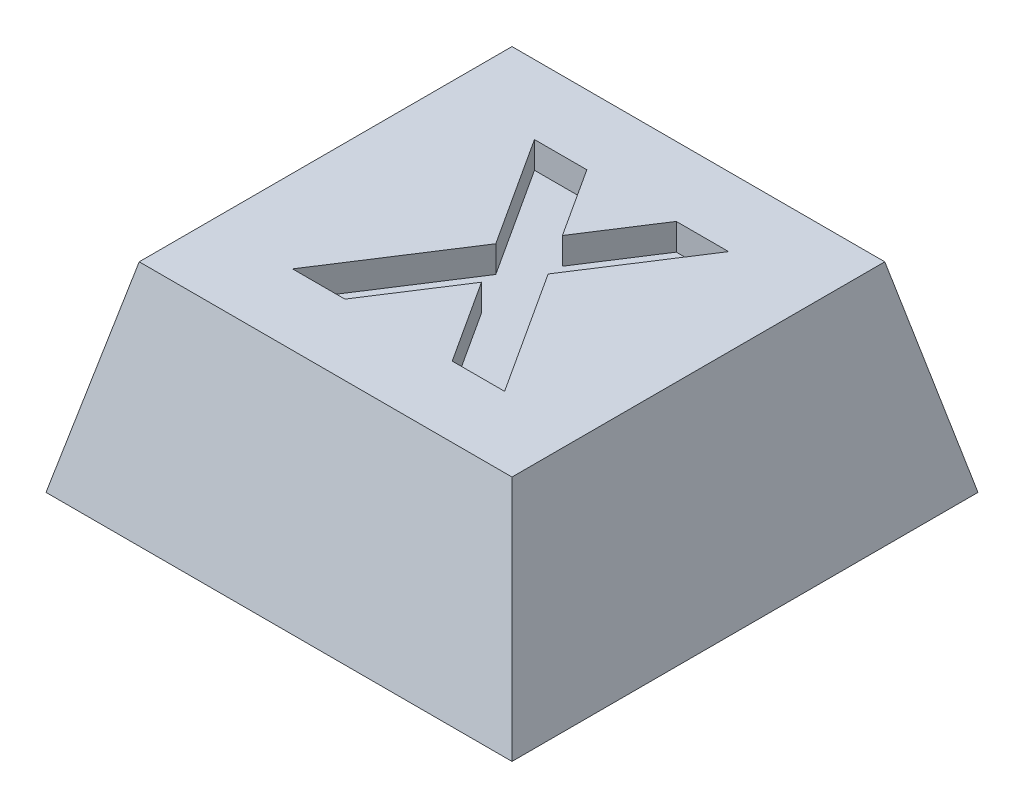
ISO-10303-21;
HEADER;
FILE_DESCRIPTION(('STEP AP214'),'2;1');
FILE_NAME('part.step','',(''),(''),'','','');
FILE_SCHEMA(('AUTOMOTIVE_DESIGN { 1 0 10303 214 1 1 1 1 }'));
ENDSEC;
DATA;
#1=APPLICATION_CONTEXT('core data for automotive mechanical design processes');
#2=APPLICATION_PROTOCOL_DEFINITION('international standard','automotive_design',2000,#1);
#3=PRODUCT_CONTEXT('',#1,'mechanical');
#4=PRODUCT('Part','Part','',(#3));
#5=PRODUCT_RELATED_PRODUCT_CATEGORY('part','',(#4));
#6=PRODUCT_DEFINITION_FORMATION('','',#4);
#7=PRODUCT_DEFINITION_CONTEXT('part definition',#1,'design');
#8=PRODUCT_DEFINITION('design','',#6,#7);
#9=PRODUCT_DEFINITION_SHAPE('','',#8);
#10=(LENGTH_UNIT() NAMED_UNIT(*) SI_UNIT(.MILLI.,.METRE.));
#11=(NAMED_UNIT(*) PLANE_ANGLE_UNIT() SI_UNIT($,.RADIAN.));
#12=(NAMED_UNIT(*) SI_UNIT($,.STERADIAN.) SOLID_ANGLE_UNIT());
#13=UNCERTAINTY_MEASURE_WITH_UNIT(LENGTH_MEASURE(1.E-05),#10,'distance_accuracy_value','');
#14=(GEOMETRIC_REPRESENTATION_CONTEXT(3) GLOBAL_UNCERTAINTY_ASSIGNED_CONTEXT((#13)) GLOBAL_UNIT_ASSIGNED_CONTEXT((#10,
#11,#12)) REPRESENTATION_CONTEXT('',''));
#15=CARTESIAN_POINT('',(0.,0.,0.));
#16=DIRECTION('',(0.,0.,1.));
#17=DIRECTION('',(1.,0.,0.));
#18=AXIS2_PLACEMENT_3D('',#15,#16,#17);
#19=CARTESIAN_POINT('',(0.,3.,0.));
#20=DIRECTION('',(0.,-1.,0.));
#21=DIRECTION('',(0.,0.,-1.));
#22=AXIS2_PLACEMENT_3D('',#19,#20,#21);
#23=PLANE('',#22);
#24=DIRECTION('',(-1.,0.,0.));
#25=VECTOR('',#24,1.);
#26=CARTESIAN_POINT('',(11.,3.,-0.7));
#27=LINE('',#26,#25);
#28=CARTESIAN_POINT('',(6.3,3.,-0.7));
#29=VERTEX_POINT('',#28);
#30=CARTESIAN_POINT('',(0.7,3.,-0.7));
#31=VERTEX_POINT('',#30);
#32=EDGE_CURVE('E65',#29,#31,#27,.T.);
#33=ORIENTED_EDGE('',*,*,#32,.F.);
#34=DIRECTION('',(0.,0.,1.));
#35=VECTOR('',#34,1.);
#36=CARTESIAN_POINT('',(6.3,3.,-7.));
#37=LINE('',#36,#35);
#38=CARTESIAN_POINT('',(6.3,3.,-6.3));
#39=VERTEX_POINT('',#38);
#40=EDGE_CURVE('E206',#39,#29,#37,.T.);
#41=ORIENTED_EDGE('',*,*,#40,.F.);
#42=DIRECTION('',(-1.,0.,0.));
#43=VECTOR('',#42,1.);
#44=CARTESIAN_POINT('',(11.,3.,-6.3));
#45=LINE('',#44,#43);
#46=CARTESIAN_POINT('',(0.699999999999998,3.,-6.3));
#47=VERTEX_POINT('',#46);
#48=EDGE_CURVE('E193',#39,#47,#45,.T.);
#49=ORIENTED_EDGE('',*,*,#48,.T.);
#50=DIRECTION('',(0.,0.,1.));
#51=VECTOR('',#50,1.);
#52=CARTESIAN_POINT('',(0.7,3.,-7.));
#53=LINE('',#52,#51);
#54=EDGE_CURVE('E207',#47,#31,#53,.T.);
#55=ORIENTED_EDGE('',*,*,#54,.T.);
#56=EDGE_LOOP('',(#33,#41,#49,#55));
#57=FACE_BOUND('',#56,.T.);
#58=DIRECTION('',(-1.,0.,0.));
#59=VECTOR('',#58,1.);
#60=CARTESIAN_POINT('',(2.73030412595201,3.,-1.75928235155919));
#61=LINE('',#60,#59);
#62=CARTESIAN_POINT('',(2.73030412595201,3.,-1.75928235155919));
#63=VERTEX_POINT('',#62);
#64=CARTESIAN_POINT('',(1.94364547210585,3.,-1.75928235155919));
#65=VERTEX_POINT('',#64);
#66=EDGE_CURVE('E58',#63,#65,#61,.T.);
#67=ORIENTED_EDGE('',*,*,#66,.T.);
#68=DIRECTION('',(0.543290774968153,0.,-0.839544599074107));
#69=VECTOR('',#68,1.);
#70=CARTESIAN_POINT('',(1.94364547210585,3.,-1.75928235155919));
#71=LINE('',#70,#69);
#72=CARTESIAN_POINT('',(3.1432648631315,3.,-3.61304837720022));
#73=VERTEX_POINT('',#72);
#74=EDGE_CURVE('E177',#65,#73,#71,.T.);
#75=ORIENTED_EDGE('',*,*,#74,.T.);
#76=DIRECTION('',(-0.543177141809505,0.,-0.839618123086714));
#77=VECTOR('',#76,1.);
#78=CARTESIAN_POINT('',(3.1432648631315,3.,-3.61304837720022));
#79=LINE('',#78,#77);
#80=CARTESIAN_POINT('',(2.07826085672124,3.,-5.25928235155919));
#81=VERTEX_POINT('',#80);
#82=EDGE_CURVE('E532',#73,#81,#79,.T.);
#83=ORIENTED_EDGE('',*,*,#82,.T.);
#84=DIRECTION('',(1.,0.,0.));
#85=VECTOR('',#84,1.);
#86=CARTESIAN_POINT('',(2.07826085672124,3.,-5.25928235155919));
#87=LINE('',#86,#85);
#88=CARTESIAN_POINT('',(2.86491951056739,3.,-5.25928235155919));
#89=VERTEX_POINT('',#88);
#90=EDGE_CURVE('E534',#81,#89,#87,.T.);
#91=ORIENTED_EDGE('',*,*,#90,.T.);
#92=DIRECTION('',(0.543133735363525,0.,0.839646202581816));
#93=VECTOR('',#92,1.);
#94=CARTESIAN_POINT('',(2.86491951056739,3.,-5.25928235155919));
#95=LINE('',#94,#93);
#96=CARTESIAN_POINT('',(3.53659419005457,3.,-4.22092097335407));
#97=VERTEX_POINT('',#96);
#98=EDGE_CURVE('E539',#89,#97,#95,.T.);
#99=ORIENTED_EDGE('',*,*,#98,.T.);
#100=DIRECTION('',(0.543133735363524,0.,-0.839646202581817));
#101=VECTOR('',#100,1.);
#102=CARTESIAN_POINT('',(3.53659419005457,3.,-4.22092097335407));
#103=LINE('',#102,#101);
#104=CARTESIAN_POINT('',(4.20826886954175,3.,-5.25928235155919));
#105=VERTEX_POINT('',#104);
#106=EDGE_CURVE('E549',#97,#105,#103,.T.);
#107=ORIENTED_EDGE('',*,*,#106,.T.);
#108=DIRECTION('',(1.,0.,0.));
#109=VECTOR('',#108,1.);
#110=CARTESIAN_POINT('',(4.20826886954175,3.,-5.25928235155919));
#111=LINE('',#110,#109);
#112=CARTESIAN_POINT('',(4.99492752338791,3.,-5.25928235155919));
#113=VERTEX_POINT('',#112);
#114=EDGE_CURVE('E553',#105,#113,#111,.T.);
#115=ORIENTED_EDGE('',*,*,#114,.T.);
#116=DIRECTION('',(-0.543177141809505,0.,0.839618123086714));
#117=VECTOR('',#116,1.);
#118=CARTESIAN_POINT('',(4.99492752338791,3.,-5.25928235155919));
#119=LINE('',#118,#117);
#120=CARTESIAN_POINT('',(3.92992351697765,3.,-3.61304837720022));
#121=VERTEX_POINT('',#120);
#122=EDGE_CURVE('E557',#113,#121,#119,.T.);
#123=ORIENTED_EDGE('',*,*,#122,.T.);
#124=DIRECTION('',(0.543290774968153,0.,0.839544599074107));
#125=VECTOR('',#124,1.);
#126=CARTESIAN_POINT('',(3.92992351697765,3.,-3.61304837720022));
#127=LINE('',#126,#125);
#128=CARTESIAN_POINT('',(5.12954290800329,3.,-1.75928235155919));
#129=VERTEX_POINT('',#128);
#130=EDGE_CURVE('E498',#121,#129,#127,.T.);
#131=ORIENTED_EDGE('',*,*,#130,.T.);
#132=DIRECTION('',(-1.,0.,0.));
#133=VECTOR('',#132,1.);
#134=CARTESIAN_POINT('',(5.12954290800329,3.,-1.75928235155919));
#135=LINE('',#134,#133);
#136=CARTESIAN_POINT('',(4.34288425415714,3.,-1.75928235155919));
#137=VERTEX_POINT('',#136);
#138=EDGE_CURVE('E493',#129,#137,#135,.T.);
#139=ORIENTED_EDGE('',*,*,#138,.T.);
#140=DIRECTION('',(-0.543310044190695,0.,-0.839532129153796));
#141=VECTOR('',#140,1.);
#142=CARTESIAN_POINT('',(4.34288425415714,3.,-1.75928235155919));
#143=LINE('',#142,#141);
#144=CARTESIAN_POINT('',(3.53659419005457,3.,-3.00517578104637));
#145=VERTEX_POINT('',#144);
#146=EDGE_CURVE('E487',#137,#145,#143,.T.);
#147=ORIENTED_EDGE('',*,*,#146,.T.);
#148=DIRECTION('',(-0.543310044190695,0.,0.839532129153796));
#149=VECTOR('',#148,1.);
#150=CARTESIAN_POINT('',(3.53659419005457,3.,-3.00517578104637));
#151=LINE('',#150,#149);
#152=EDGE_CURVE('E173',#145,#63,#151,.T.);
#153=ORIENTED_EDGE('',*,*,#152,.T.);
#154=EDGE_LOOP('',(#67,#75,#83,#91,#99,#107,#115,#123,#131,#139,#147,#153));
#155=FACE_BOUND('',#154,.T.);
#156=ADVANCED_FACE('F42',(#57,#155),#23,.F.);
#157=CARTESIAN_POINT('',(7.,0.,-7.));
#158=DIRECTION('',(-0.973841209741793,-0.227229615606418,0.));
#159=DIRECTION('',(0.227229615606418,-0.973841209741793,0.));
#160=AXIS2_PLACEMENT_3D('',#157,#158,#159);
#161=PLANE('',#160);
#162=DIRECTION('',(-0.221581128241521,0.949633406749377,-0.221581128241521));
#163=VECTOR('',#162,1.);
#164=CARTESIAN_POINT('',(6.6563126252505,1.47294589178357,-0.343687374749499));
#165=LINE('',#164,#163);
#166=CARTESIAN_POINT('',(7.,0.,0.));
#167=VERTEX_POINT('',#166);
#168=EDGE_CURVE('E203',#167,#29,#165,.T.);
#169=ORIENTED_EDGE('',*,*,#168,.F.);
#170=DIRECTION('',(0.,0.,-1.));
#171=VECTOR('',#170,1.);
#172=CARTESIAN_POINT('',(7.,0.,0.));
#173=LINE('',#172,#171);
#174=CARTESIAN_POINT('',(7.,0.,-7.));
#175=VERTEX_POINT('',#174);
#176=EDGE_CURVE('E221',#167,#175,#173,.T.);
#177=ORIENTED_EDGE('',*,*,#176,.T.);
#178=DIRECTION('',(0.221581128241521,-0.949633406749377,-0.221581128241521));
#179=VECTOR('',#178,1.);
#180=CARTESIAN_POINT('',(7.,0.,-7.));
#181=LINE('',#180,#179);
#182=EDGE_CURVE('E197',#39,#175,#181,.T.);
#183=ORIENTED_EDGE('',*,*,#182,.F.);
#184=ORIENTED_EDGE('',*,*,#40,.T.);
#185=EDGE_LOOP('',(#169,#177,#183,#184));
#186=FACE_BOUND('',#185,.T.);
#187=ADVANCED_FACE('F246',(#186),#161,.F.);
#188=CARTESIAN_POINT('',(0.,0.,-7.));
#189=DIRECTION('',(0.973841209741793,-0.227229615606418,0.));
#190=DIRECTION('',(0.227229615606418,0.973841209741793,0.));
#191=AXIS2_PLACEMENT_3D('',#188,#189,#190);
#192=PLANE('',#191);
#193=DIRECTION('',(-0.221581128241521,-0.949633406749378,0.221581128241521));
#194=VECTOR('',#193,1.);
#195=CARTESIAN_POINT('',(0.343687374749499,1.47294589178357,-0.3436873747495));
#196=LINE('',#195,#194);
#197=CARTESIAN_POINT('',(0.,0.,0.));
#198=VERTEX_POINT('',#197);
#199=EDGE_CURVE('E11',#31,#198,#196,.T.);
#200=ORIENTED_EDGE('',*,*,#199,.F.);
#201=ORIENTED_EDGE('',*,*,#54,.F.);
#202=DIRECTION('',(0.221581128241521,0.949633406749377,0.221581128241521));
#203=VECTOR('',#202,1.);
#204=CARTESIAN_POINT('',(0.,0.,-7.));
#205=LINE('',#204,#203);
#206=CARTESIAN_POINT('',(0.,0.,-7.));
#207=VERTEX_POINT('',#206);
#208=EDGE_CURVE('E51',#207,#47,#205,.T.);
#209=ORIENTED_EDGE('',*,*,#208,.F.);
#210=DIRECTION('',(0.,0.,1.));
#211=VECTOR('',#210,1.);
#212=CARTESIAN_POINT('',(0.,0.,0.));
#213=LINE('',#212,#211);
#214=EDGE_CURVE('E211',#207,#198,#213,.T.);
#215=ORIENTED_EDGE('',*,*,#214,.T.);
#216=EDGE_LOOP('',(#200,#201,#209,#215));
#217=FACE_BOUND('',#216,.T.);
#218=ADVANCED_FACE('F239',(#217),#192,.F.);
#219=CARTESIAN_POINT('',(0.,0.,0.));
#220=DIRECTION('',(0.,-1.,0.));
#221=DIRECTION('',(0.,0.,-1.));
#222=AXIS2_PLACEMENT_3D('',#219,#220,#221);
#223=PLANE('',#222);
#224=CARTESIAN_POINT('',(3.5,0.,-3.5));
#225=DIRECTION('',(0.,-1.,0.));
#226=DIRECTION('',(0.,0.,-1.));
#227=AXIS2_PLACEMENT_3D('',#224,#225,#226);
#228=CIRCLE('',#227,1.8);
#229=CARTESIAN_POINT('',(3.5,0.,-5.3));
#230=VERTEX_POINT('',#229);
#231=EDGE_CURVE('E179',#230,#230,#228,.T.);
#232=ORIENTED_EDGE('',*,*,#231,.F.);
#233=EDGE_LOOP('',(#232));
#234=FACE_BOUND('',#233,.T.);
#235=ORIENTED_EDGE('',*,*,#214,.F.);
#236=DIRECTION('',(-1.,0.,0.));
#237=VECTOR('',#236,1.);
#238=CARTESIAN_POINT('',(0.,0.,-7.));
#239=LINE('',#238,#237);
#240=EDGE_CURVE('E225',#175,#207,#239,.T.);
#241=ORIENTED_EDGE('',*,*,#240,.F.);
#242=ORIENTED_EDGE('',*,*,#176,.F.);
#243=DIRECTION('',(1.,0.,0.));
#244=VECTOR('',#243,1.);
#245=CARTESIAN_POINT('',(0.,0.,0.));
#246=LINE('',#245,#244);
#247=EDGE_CURVE('E218',#198,#167,#246,.T.);
#248=ORIENTED_EDGE('',*,*,#247,.F.);
#249=EDGE_LOOP('',(#235,#241,#242,#248));
#250=FACE_BOUND('',#249,.T.);
#251=ADVANCED_FACE('F44',(#234,#250),#223,.T.);
#252=CARTESIAN_POINT('',(11.,3.,-6.3));
#253=DIRECTION('',(0.,0.227229615606418,-0.973841209741793));
#254=DIRECTION('',(0.,0.973841209741793,0.227229615606418));
#255=AXIS2_PLACEMENT_3D('',#252,#253,#254);
#256=PLANE('',#255);
#257=ORIENTED_EDGE('',*,*,#182,.T.);
#258=ORIENTED_EDGE('',*,*,#240,.T.);
#259=ORIENTED_EDGE('',*,*,#208,.T.);
#260=ORIENTED_EDGE('',*,*,#48,.F.);
#261=EDGE_LOOP('',(#257,#258,#259,#260));
#262=FACE_BOUND('',#261,.T.);
#263=ADVANCED_FACE('F230',(#262),#256,.T.);
#264=CARTESIAN_POINT('',(11.,0.,0.));
#265=DIRECTION('',(0.,0.227229615606418,0.973841209741793));
#266=DIRECTION('',(0.,-0.973841209741793,0.227229615606418));
#267=AXIS2_PLACEMENT_3D('',#264,#265,#266);
#268=PLANE('',#267);
#269=ORIENTED_EDGE('',*,*,#168,.T.);
#270=ORIENTED_EDGE('',*,*,#32,.T.);
#271=ORIENTED_EDGE('',*,*,#199,.T.);
#272=ORIENTED_EDGE('',*,*,#247,.T.);
#273=EDGE_LOOP('',(#269,#270,#271,#272));
#274=FACE_BOUND('',#273,.T.);
#275=ADVANCED_FACE('F241',(#274),#268,.T.);
#276=CARTESIAN_POINT('',(3.5,0.8,-3.5));
#277=DIRECTION('',(0.,-1.,0.));
#278=DIRECTION('',(0.,0.,-1.));
#279=AXIS2_PLACEMENT_3D('',#276,#277,#278);
#280=CYLINDRICAL_SURFACE('',#279,1.8);
#281=CARTESIAN_POINT('',(3.5,0.8,-3.5));
#282=DIRECTION('',(0.,-1.,0.));
#283=DIRECTION('',(0.,0.,-1.));
#284=AXIS2_PLACEMENT_3D('',#281,#282,#283);
#285=CIRCLE('',#284,1.8);
#286=CARTESIAN_POINT('',(3.5,0.8,-5.3));
#287=VERTEX_POINT('',#286);
#288=EDGE_CURVE('E185',#287,#287,#285,.T.);
#289=ORIENTED_EDGE('',*,*,#288,.F.);
#290=EDGE_LOOP('',(#289));
#291=FACE_BOUND('',#290,.T.);
#292=ORIENTED_EDGE('',*,*,#231,.T.);
#293=EDGE_LOOP('',(#292));
#294=FACE_BOUND('',#293,.T.);
#295=ADVANCED_FACE('F266',(#291,#294),#280,.F.);
#296=CARTESIAN_POINT('',(3.5,0.8,-3.5));
#297=DIRECTION('',(0.,-1.,0.));
#298=DIRECTION('',(0.,0.,-1.));
#299=AXIS2_PLACEMENT_3D('',#296,#297,#298);
#300=PLANE('',#299);
#301=ORIENTED_EDGE('',*,*,#288,.T.);
#302=EDGE_LOOP('',(#301));
#303=FACE_BOUND('',#302,.T.);
#304=ADVANCED_FACE('F269',(#303),#300,.T.);
#305=CARTESIAN_POINT('',(2.73030412595201,2.6,-1.75928235155919));
#306=DIRECTION('',(0.,0.,-1.));
#307=DIRECTION('',(-1.,0.,0.));
#308=AXIS2_PLACEMENT_3D('',#305,#306,#307);
#309=PLANE('',#308);
#310=ORIENTED_EDGE('',*,*,#66,.F.);
#311=DIRECTION('',(0.,1.,0.));
#312=VECTOR('',#311,1.);
#313=CARTESIAN_POINT('',(2.73030412595201,2.6,-1.75928235155919));
#314=LINE('',#313,#312);
#315=CARTESIAN_POINT('',(2.73030412595201,2.6,-1.75928235155919));
#316=VERTEX_POINT('',#315);
#317=EDGE_CURVE('E171',#316,#63,#314,.T.);
#318=ORIENTED_EDGE('',*,*,#317,.F.);
#319=DIRECTION('',(-1.,0.,0.));
#320=VECTOR('',#319,1.);
#321=CARTESIAN_POINT('',(2.73030412595201,2.6,-1.75928235155919));
#322=LINE('',#321,#320);
#323=CARTESIAN_POINT('',(1.94364547210585,2.6,-1.75928235155919));
#324=VERTEX_POINT('',#323);
#325=EDGE_CURVE('E161',#316,#324,#322,.T.);
#326=ORIENTED_EDGE('',*,*,#325,.T.);
#327=DIRECTION('',(0.,1.,0.));
#328=VECTOR('',#327,1.);
#329=CARTESIAN_POINT('',(1.94364547210585,2.6,-1.75928235155919));
#330=LINE('',#329,#328);
#331=EDGE_CURVE('E170',#324,#65,#330,.T.);
#332=ORIENTED_EDGE('',*,*,#331,.T.);
#333=EDGE_LOOP('',(#310,#318,#326,#332));
#334=FACE_BOUND('',#333,.T.);
#335=ADVANCED_FACE('F169',(#334),#309,.T.);
#336=CARTESIAN_POINT('',(1.94364547210585,2.6,-1.75928235155919));
#337=DIRECTION('',(0.839544599074107,0.,0.543290774968153));
#338=DIRECTION('',(0.543290774968153,0.,-0.839544599074107));
#339=AXIS2_PLACEMENT_3D('',#336,#337,#338);
#340=PLANE('',#339);
#341=ORIENTED_EDGE('',*,*,#74,.F.);
#342=ORIENTED_EDGE('',*,*,#331,.F.);
#343=DIRECTION('',(0.543290774968153,0.,-0.839544599074107));
#344=VECTOR('',#343,1.);
#345=CARTESIAN_POINT('',(1.94364547210585,2.6,-1.75928235155919));
#346=LINE('',#345,#344);
#347=CARTESIAN_POINT('',(3.1432648631315,2.6,-3.61304837720022));
#348=VERTEX_POINT('',#347);
#349=EDGE_CURVE('E157',#324,#348,#346,.T.);
#350=ORIENTED_EDGE('',*,*,#349,.T.);
#351=DIRECTION('',(0.,1.,0.));
#352=VECTOR('',#351,1.);
#353=CARTESIAN_POINT('',(3.1432648631315,2.6,-3.61304837720022));
#354=LINE('',#353,#352);
#355=EDGE_CURVE('E180',#348,#73,#354,.T.);
#356=ORIENTED_EDGE('',*,*,#355,.T.);
#357=EDGE_LOOP('',(#341,#342,#350,#356));
#358=FACE_BOUND('',#357,.T.);
#359=ADVANCED_FACE('F175',(#358),#340,.T.);
#360=CARTESIAN_POINT('',(3.1432648631315,2.6,-3.61304837720022));
#361=DIRECTION('',(0.839618123086714,0.,-0.543177141809505));
#362=DIRECTION('',(-0.543177141809505,0.,-0.839618123086714));
#363=AXIS2_PLACEMENT_3D('',#360,#361,#362);
#364=PLANE('',#363);
#365=ORIENTED_EDGE('',*,*,#82,.F.);
#366=ORIENTED_EDGE('',*,*,#355,.F.);
#367=DIRECTION('',(-0.543177141809505,0.,-0.839618123086714));
#368=VECTOR('',#367,1.);
#369=CARTESIAN_POINT('',(3.1432648631315,2.6,-3.61304837720022));
#370=LINE('',#369,#368);
#371=CARTESIAN_POINT('',(2.07826085672124,2.6,-5.25928235155919));
#372=VERTEX_POINT('',#371);
#373=EDGE_CURVE('E163',#348,#372,#370,.T.);
#374=ORIENTED_EDGE('',*,*,#373,.T.);
#375=DIRECTION('',(0.,1.,0.));
#376=VECTOR('',#375,1.);
#377=CARTESIAN_POINT('',(2.07826085672124,2.6,-5.25928235155919));
#378=LINE('',#377,#376);
#379=EDGE_CURVE('E187',#372,#81,#378,.T.);
#380=ORIENTED_EDGE('',*,*,#379,.T.);
#381=EDGE_LOOP('',(#365,#366,#374,#380));
#382=FACE_BOUND('',#381,.T.);
#383=ADVANCED_FACE('F278',(#382),#364,.T.);
#384=CARTESIAN_POINT('',(2.07826085672124,2.6,-5.25928235155919));
#385=DIRECTION('',(0.,0.,1.));
#386=DIRECTION('',(1.,0.,0.));
#387=AXIS2_PLACEMENT_3D('',#384,#385,#386);
#388=PLANE('',#387);
#389=ORIENTED_EDGE('',*,*,#90,.F.);
#390=ORIENTED_EDGE('',*,*,#379,.F.);
#391=DIRECTION('',(1.,0.,0.));
#392=VECTOR('',#391,1.);
#393=CARTESIAN_POINT('',(2.07826085672124,2.6,-5.25928235155919));
#394=LINE('',#393,#392);
#395=CARTESIAN_POINT('',(2.86491951056739,2.6,-5.25928235155919));
#396=VERTEX_POINT('',#395);
#397=EDGE_CURVE('E593',#372,#396,#394,.T.);
#398=ORIENTED_EDGE('',*,*,#397,.T.);
#399=DIRECTION('',(0.,1.,0.));
#400=VECTOR('',#399,1.);
#401=CARTESIAN_POINT('',(2.86491951056739,2.6,-5.25928235155919));
#402=LINE('',#401,#400);
#403=EDGE_CURVE('E525',#396,#89,#402,.T.);
#404=ORIENTED_EDGE('',*,*,#403,.T.);
#405=EDGE_LOOP('',(#389,#390,#398,#404));
#406=FACE_BOUND('',#405,.T.);
#407=ADVANCED_FACE('F281',(#406),#388,.T.);
#408=CARTESIAN_POINT('',(2.86491951056739,2.6,-5.25928235155919));
#409=DIRECTION('',(-0.839646202581816,0.,0.543133735363525));
#410=DIRECTION('',(0.543133735363525,0.,0.839646202581816));
#411=AXIS2_PLACEMENT_3D('',#408,#409,#410);
#412=PLANE('',#411);
#413=ORIENTED_EDGE('',*,*,#98,.F.);
#414=ORIENTED_EDGE('',*,*,#403,.F.);
#415=DIRECTION('',(0.543133735363525,0.,0.839646202581816));
#416=VECTOR('',#415,1.);
#417=CARTESIAN_POINT('',(2.86491951056739,2.6,-5.25928235155919));
#418=LINE('',#417,#416);
#419=CARTESIAN_POINT('',(3.53659419005457,2.6,-4.22092097335407));
#420=VERTEX_POINT('',#419);
#421=EDGE_CURVE('E590',#396,#420,#418,.T.);
#422=ORIENTED_EDGE('',*,*,#421,.T.);
#423=DIRECTION('',(0.,1.,0.));
#424=VECTOR('',#423,1.);
#425=CARTESIAN_POINT('',(3.53659419005457,2.6,-4.22092097335407));
#426=LINE('',#425,#424);
#427=EDGE_CURVE('E522',#420,#97,#426,.T.);
#428=ORIENTED_EDGE('',*,*,#427,.T.);
#429=EDGE_LOOP('',(#413,#414,#422,#428));
#430=FACE_BOUND('',#429,.T.);
#431=ADVANCED_FACE('F285',(#430),#412,.T.);
#432=CARTESIAN_POINT('',(3.53659419005457,2.6,-4.22092097335407));
#433=DIRECTION('',(0.839646202581817,0.,0.543133735363524));
#434=DIRECTION('',(0.543133735363524,0.,-0.839646202581817));
#435=AXIS2_PLACEMENT_3D('',#432,#433,#434);
#436=PLANE('',#435);
#437=ORIENTED_EDGE('',*,*,#106,.F.);
#438=ORIENTED_EDGE('',*,*,#427,.F.);
#439=DIRECTION('',(0.543133735363524,0.,-0.839646202581817));
#440=VECTOR('',#439,1.);
#441=CARTESIAN_POINT('',(3.53659419005457,2.6,-4.22092097335407));
#442=LINE('',#441,#440);
#443=CARTESIAN_POINT('',(4.20826886954175,2.6,-5.25928235155919));
#444=VERTEX_POINT('',#443);
#445=EDGE_CURVE('E587',#420,#444,#442,.T.);
#446=ORIENTED_EDGE('',*,*,#445,.T.);
#447=DIRECTION('',(0.,1.,0.));
#448=VECTOR('',#447,1.);
#449=CARTESIAN_POINT('',(4.20826886954175,2.6,-5.25928235155919));
#450=LINE('',#449,#448);
#451=EDGE_CURVE('E519',#444,#105,#450,.T.);
#452=ORIENTED_EDGE('',*,*,#451,.T.);
#453=EDGE_LOOP('',(#437,#438,#446,#452));
#454=FACE_BOUND('',#453,.T.);
#455=ADVANCED_FACE('F289',(#454),#436,.T.);
#456=CARTESIAN_POINT('',(4.20826886954175,2.6,-5.25928235155919));
#457=DIRECTION('',(0.,0.,1.));
#458=DIRECTION('',(1.,0.,0.));
#459=AXIS2_PLACEMENT_3D('',#456,#457,#458);
#460=PLANE('',#459);
#461=ORIENTED_EDGE('',*,*,#114,.F.);
#462=ORIENTED_EDGE('',*,*,#451,.F.);
#463=DIRECTION('',(1.,0.,0.));
#464=VECTOR('',#463,1.);
#465=CARTESIAN_POINT('',(4.20826886954175,2.6,-5.25928235155919));
#466=LINE('',#465,#464);
#467=CARTESIAN_POINT('',(4.99492752338791,2.6,-5.25928235155919));
#468=VERTEX_POINT('',#467);
#469=EDGE_CURVE('E584',#444,#468,#466,.T.);
#470=ORIENTED_EDGE('',*,*,#469,.T.);
#471=DIRECTION('',(0.,1.,0.));
#472=VECTOR('',#471,1.);
#473=CARTESIAN_POINT('',(4.99492752338791,2.6,-5.25928235155919));
#474=LINE('',#473,#472);
#475=EDGE_CURVE('E516',#468,#113,#474,.T.);
#476=ORIENTED_EDGE('',*,*,#475,.T.);
#477=EDGE_LOOP('',(#461,#462,#470,#476));
#478=FACE_BOUND('',#477,.T.);
#479=ADVANCED_FACE('F293',(#478),#460,.T.);
#480=CARTESIAN_POINT('',(4.99492752338791,2.6,-5.25928235155919));
#481=DIRECTION('',(-0.839618123086714,0.,-0.543177141809505));
#482=DIRECTION('',(-0.543177141809505,0.,0.839618123086714));
#483=AXIS2_PLACEMENT_3D('',#480,#481,#482);
#484=PLANE('',#483);
#485=ORIENTED_EDGE('',*,*,#122,.F.);
#486=ORIENTED_EDGE('',*,*,#475,.F.);
#487=DIRECTION('',(-0.543177141809505,0.,0.839618123086714));
#488=VECTOR('',#487,1.);
#489=CARTESIAN_POINT('',(4.99492752338791,2.6,-5.25928235155919));
#490=LINE('',#489,#488);
#491=CARTESIAN_POINT('',(3.92992351697765,2.6,-3.61304837720022));
#492=VERTEX_POINT('',#491);
#493=EDGE_CURVE('E581',#468,#492,#490,.T.);
#494=ORIENTED_EDGE('',*,*,#493,.T.);
#495=DIRECTION('',(0.,1.,0.));
#496=VECTOR('',#495,1.);
#497=CARTESIAN_POINT('',(3.92992351697765,2.6,-3.61304837720022));
#498=LINE('',#497,#496);
#499=EDGE_CURVE('E513',#492,#121,#498,.T.);
#500=ORIENTED_EDGE('',*,*,#499,.T.);
#501=EDGE_LOOP('',(#485,#486,#494,#500));
#502=FACE_BOUND('',#501,.T.);
#503=ADVANCED_FACE('F297',(#502),#484,.T.);
#504=CARTESIAN_POINT('',(3.92992351697765,2.6,-3.61304837720022));
#505=DIRECTION('',(-0.839544599074107,0.,0.543290774968153));
#506=DIRECTION('',(0.543290774968153,0.,0.839544599074107));
#507=AXIS2_PLACEMENT_3D('',#504,#505,#506);
#508=PLANE('',#507);
#509=ORIENTED_EDGE('',*,*,#130,.F.);
#510=ORIENTED_EDGE('',*,*,#499,.F.);
#511=DIRECTION('',(0.543290774968153,0.,0.839544599074107));
#512=VECTOR('',#511,1.);
#513=CARTESIAN_POINT('',(3.92992351697765,2.6,-3.61304837720022));
#514=LINE('',#513,#512);
#515=CARTESIAN_POINT('',(5.12954290800329,2.6,-1.75928235155919));
#516=VERTEX_POINT('',#515);
#517=EDGE_CURVE('E566',#492,#516,#514,.T.);
#518=ORIENTED_EDGE('',*,*,#517,.T.);
#519=DIRECTION('',(0.,1.,0.));
#520=VECTOR('',#519,1.);
#521=CARTESIAN_POINT('',(5.12954290800329,2.6,-1.75928235155919));
#522=LINE('',#521,#520);
#523=EDGE_CURVE('E510',#516,#129,#522,.T.);
#524=ORIENTED_EDGE('',*,*,#523,.T.);
#525=EDGE_LOOP('',(#509,#510,#518,#524));
#526=FACE_BOUND('',#525,.T.);
#527=ADVANCED_FACE('F301',(#526),#508,.T.);
#528=CARTESIAN_POINT('',(5.12954290800329,2.6,-1.75928235155919));
#529=DIRECTION('',(0.,0.,-1.));
#530=DIRECTION('',(-1.,0.,0.));
#531=AXIS2_PLACEMENT_3D('',#528,#529,#530);
#532=PLANE('',#531);
#533=ORIENTED_EDGE('',*,*,#138,.F.);
#534=ORIENTED_EDGE('',*,*,#523,.F.);
#535=DIRECTION('',(-1.,0.,0.));
#536=VECTOR('',#535,1.);
#537=CARTESIAN_POINT('',(5.12954290800329,2.6,-1.75928235155919));
#538=LINE('',#537,#536);
#539=CARTESIAN_POINT('',(4.34288425415714,2.6,-1.75928235155919));
#540=VERTEX_POINT('',#539);
#541=EDGE_CURVE('E568',#516,#540,#538,.T.);
#542=ORIENTED_EDGE('',*,*,#541,.T.);
#543=DIRECTION('',(0.,1.,0.));
#544=VECTOR('',#543,1.);
#545=CARTESIAN_POINT('',(4.34288425415714,2.6,-1.75928235155919));
#546=LINE('',#545,#544);
#547=EDGE_CURVE('E507',#540,#137,#546,.T.);
#548=ORIENTED_EDGE('',*,*,#547,.T.);
#549=EDGE_LOOP('',(#533,#534,#542,#548));
#550=FACE_BOUND('',#549,.T.);
#551=ADVANCED_FACE('F305',(#550),#532,.T.);
#552=CARTESIAN_POINT('',(4.34288425415714,2.6,-1.75928235155919));
#553=DIRECTION('',(0.839532129153796,0.,-0.543310044190695));
#554=DIRECTION('',(-0.543310044190695,0.,-0.839532129153796));
#555=AXIS2_PLACEMENT_3D('',#552,#553,#554);
#556=PLANE('',#555);
#557=ORIENTED_EDGE('',*,*,#146,.F.);
#558=ORIENTED_EDGE('',*,*,#547,.F.);
#559=DIRECTION('',(-0.543310044190695,0.,-0.839532129153796));
#560=VECTOR('',#559,1.);
#561=CARTESIAN_POINT('',(4.34288425415714,2.6,-1.75928235155919));
#562=LINE('',#561,#560);
#563=CARTESIAN_POINT('',(3.53659419005457,2.6,-3.00517578104637));
#564=VERTEX_POINT('',#563);
#565=EDGE_CURVE('E570',#540,#564,#562,.T.);
#566=ORIENTED_EDGE('',*,*,#565,.T.);
#567=DIRECTION('',(0.,1.,0.));
#568=VECTOR('',#567,1.);
#569=CARTESIAN_POINT('',(3.53659419005457,2.6,-3.00517578104637));
#570=LINE('',#569,#568);
#571=EDGE_CURVE('E485',#564,#145,#570,.T.);
#572=ORIENTED_EDGE('',*,*,#571,.T.);
#573=EDGE_LOOP('',(#557,#558,#566,#572));
#574=FACE_BOUND('',#573,.T.);
#575=ADVANCED_FACE('F309',(#574),#556,.T.);
#576=CARTESIAN_POINT('',(3.53659419005457,2.6,-3.00517578104637));
#577=DIRECTION('',(-0.839532129153795,0.,-0.543310044190695));
#578=DIRECTION('',(-0.543310044190695,0.,0.839532129153795));
#579=AXIS2_PLACEMENT_3D('',#576,#577,#578);
#580=PLANE('',#579);
#581=ORIENTED_EDGE('',*,*,#152,.F.);
#582=ORIENTED_EDGE('',*,*,#571,.F.);
#583=DIRECTION('',(-0.543310044190695,0.,0.839532129153796));
#584=VECTOR('',#583,1.);
#585=CARTESIAN_POINT('',(3.53659419005457,2.6,-3.00517578104637));
#586=LINE('',#585,#584);
#587=EDGE_CURVE('E504',#564,#316,#586,.T.);
#588=ORIENTED_EDGE('',*,*,#587,.T.);
#589=ORIENTED_EDGE('',*,*,#317,.T.);
#590=EDGE_LOOP('',(#581,#582,#588,#589));
#591=FACE_BOUND('',#590,.T.);
#592=ADVANCED_FACE('F313',(#591),#580,.T.);
#593=CARTESIAN_POINT('',(0.,2.6,0.));
#594=DIRECTION('',(0.,1.,0.));
#595=DIRECTION('',(0.,0.,1.));
#596=AXIS2_PLACEMENT_3D('',#593,#594,#595);
#597=PLANE('',#596);
#598=ORIENTED_EDGE('',*,*,#325,.F.);
#599=ORIENTED_EDGE('',*,*,#587,.F.);
#600=ORIENTED_EDGE('',*,*,#565,.F.);
#601=ORIENTED_EDGE('',*,*,#541,.F.);
#602=ORIENTED_EDGE('',*,*,#517,.F.);
#603=ORIENTED_EDGE('',*,*,#493,.F.);
#604=ORIENTED_EDGE('',*,*,#469,.F.);
#605=ORIENTED_EDGE('',*,*,#445,.F.);
#606=ORIENTED_EDGE('',*,*,#421,.F.);
#607=ORIENTED_EDGE('',*,*,#397,.F.);
#608=ORIENTED_EDGE('',*,*,#373,.F.);
#609=ORIENTED_EDGE('',*,*,#349,.F.);
#610=EDGE_LOOP('',(#598,#599,#600,#601,#602,#603,#604,#605,#606,#607,#608,#609));
#611=FACE_BOUND('',#610,.T.);
#612=ADVANCED_FACE('F159',(#611),#597,.T.);
#613=CLOSED_SHELL('',(#156,#187,#218,#251,#263,#275,#295,#304,#335,#359,#383,#407,#431,#455,
#479,#503,#527,#551,#575,#592,#612));
#614=MANIFOLD_SOLID_BREP('B2',#613);
#615=ADVANCED_BREP_SHAPE_REPRESENTATION('',(#18,#614),#14);
#616=SHAPE_DEFINITION_REPRESENTATION(#9,#615);
ENDSEC;
END-ISO-10303-21;
